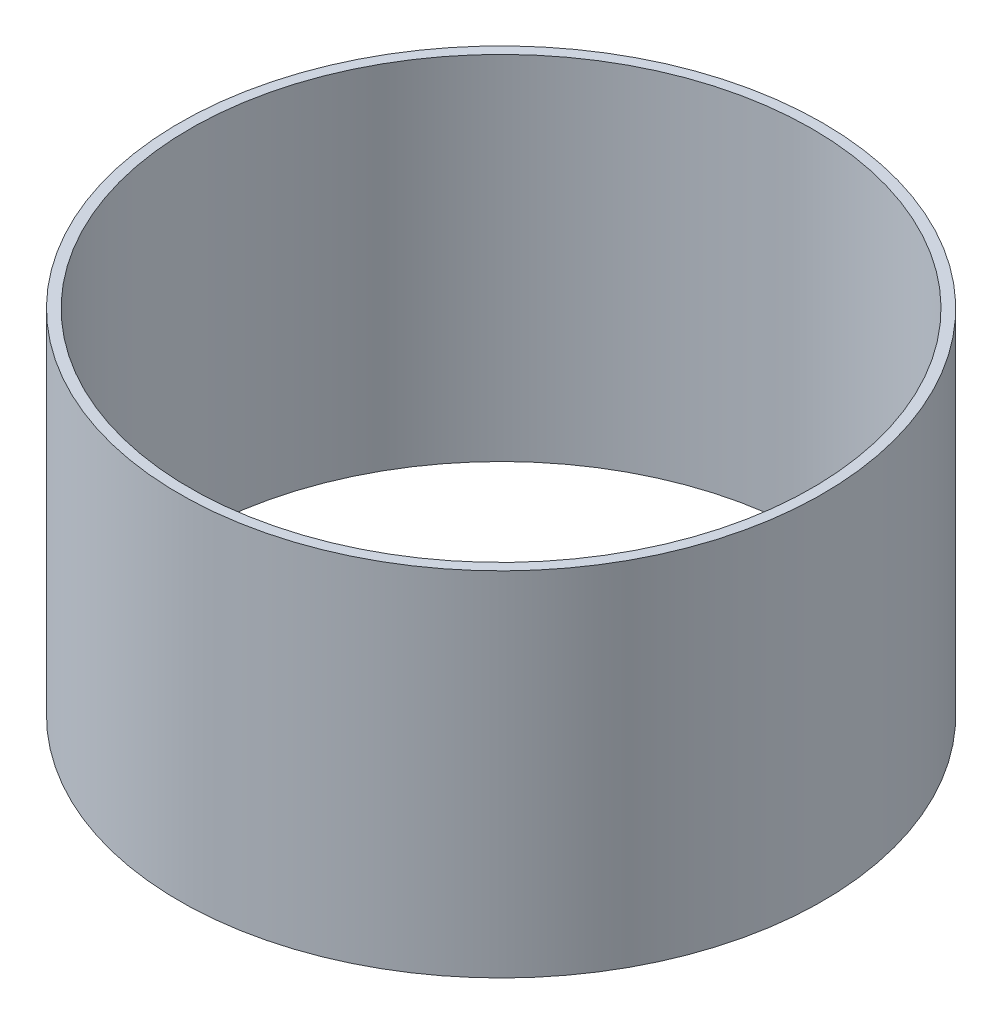
ISO-10303-21;
HEADER;
FILE_DESCRIPTION(('STEP AP214'),'2;1');
FILE_NAME('part.step','',(''),(''),'','','');
FILE_SCHEMA(('AUTOMOTIVE_DESIGN { 1 0 10303 214 1 1 1 1 }'));
ENDSEC;
DATA;
#1=APPLICATION_CONTEXT('core data for automotive mechanical design processes');
#2=APPLICATION_PROTOCOL_DEFINITION('international standard','automotive_design',2000,#1);
#3=PRODUCT_CONTEXT('',#1,'mechanical');
#4=PRODUCT('Part','Part','',(#3));
#5=PRODUCT_RELATED_PRODUCT_CATEGORY('part','',(#4));
#6=PRODUCT_DEFINITION_FORMATION('','',#4);
#7=PRODUCT_DEFINITION_CONTEXT('part definition',#1,'design');
#8=PRODUCT_DEFINITION('design','',#6,#7);
#9=PRODUCT_DEFINITION_SHAPE('','',#8);
#10=(LENGTH_UNIT() NAMED_UNIT(*) SI_UNIT(.MILLI.,.METRE.));
#11=(NAMED_UNIT(*) PLANE_ANGLE_UNIT() SI_UNIT($,.RADIAN.));
#12=(NAMED_UNIT(*) SI_UNIT($,.STERADIAN.) SOLID_ANGLE_UNIT());
#13=UNCERTAINTY_MEASURE_WITH_UNIT(LENGTH_MEASURE(1.E-05),#10,'distance_accuracy_value','');
#14=(GEOMETRIC_REPRESENTATION_CONTEXT(3) GLOBAL_UNCERTAINTY_ASSIGNED_CONTEXT((#13)) GLOBAL_UNIT_ASSIGNED_CONTEXT((#10,
#11,#12)) REPRESENTATION_CONTEXT('',''));
#15=CARTESIAN_POINT('',(0.,0.,0.));
#16=DIRECTION('',(0.,0.,1.));
#17=DIRECTION('',(1.,0.,0.));
#18=AXIS2_PLACEMENT_3D('',#15,#16,#17);
#19=CARTESIAN_POINT('',(0.,0.,0.));
#20=DIRECTION('',(0.,-1.,0.));
#21=DIRECTION('',(0.,0.,-1.));
#22=AXIS2_PLACEMENT_3D('',#19,#20,#21);
#23=CYLINDRICAL_SURFACE('',#22,155.);
#24=CARTESIAN_POINT('',(0.,170.,0.));
#25=DIRECTION('',(0.,-1.,0.));
#26=DIRECTION('',(0.,0.,-1.));
#27=AXIS2_PLACEMENT_3D('',#24,#25,#26);
#28=CIRCLE('',#27,155.);
#29=CARTESIAN_POINT('',(0.,170.,-155.));
#30=VERTEX_POINT('',#29);
#31=EDGE_CURVE('E10',#30,#30,#28,.T.);
#32=ORIENTED_EDGE('',*,*,#31,.T.);
#33=EDGE_LOOP('',(#32));
#34=FACE_BOUND('',#33,.T.);
#35=CARTESIAN_POINT('',(0.,0.,0.));
#36=DIRECTION('',(0.,-1.,0.));
#37=DIRECTION('',(0.,0.,-1.));
#38=AXIS2_PLACEMENT_3D('',#35,#36,#37);
#39=CIRCLE('',#38,155.);
#40=CARTESIAN_POINT('',(0.,0.,-155.));
#41=VERTEX_POINT('',#40);
#42=EDGE_CURVE('E53',#41,#41,#39,.T.);
#43=ORIENTED_EDGE('',*,*,#42,.F.);
#44=EDGE_LOOP('',(#43));
#45=FACE_BOUND('',#44,.T.);
#46=ADVANCED_FACE('F39',(#34,#45),#23,.T.);
#47=CARTESIAN_POINT('',(155.,170.,0.));
#48=DIRECTION('',(0.,1.,0.));
#49=DIRECTION('',(0.,0.,1.));
#50=AXIS2_PLACEMENT_3D('',#47,#48,#49);
#51=PLANE('',#50);
#52=CARTESIAN_POINT('',(0.,170.,0.));
#53=DIRECTION('',(0.,-1.,0.));
#54=DIRECTION('',(0.,0.,-1.));
#55=AXIS2_PLACEMENT_3D('',#52,#53,#54);
#56=CIRCLE('',#55,150.);
#57=CARTESIAN_POINT('',(0.,170.,-150.));
#58=VERTEX_POINT('',#57);
#59=EDGE_CURVE('E45',#58,#58,#56,.T.);
#60=ORIENTED_EDGE('',*,*,#59,.T.);
#61=EDGE_LOOP('',(#60));
#62=FACE_BOUND('',#61,.T.);
#63=ORIENTED_EDGE('',*,*,#31,.F.);
#64=EDGE_LOOP('',(#63));
#65=FACE_BOUND('',#64,.T.);
#66=ADVANCED_FACE('F63',(#62,#65),#51,.T.);
#67=CARTESIAN_POINT('',(0.,0.,0.));
#68=DIRECTION('',(0.,-1.,0.));
#69=DIRECTION('',(0.,0.,-1.));
#70=AXIS2_PLACEMENT_3D('',#67,#68,#69);
#71=CYLINDRICAL_SURFACE('',#70,150.);
#72=CARTESIAN_POINT('',(0.,0.,0.));
#73=DIRECTION('',(0.,-1.,0.));
#74=DIRECTION('',(0.,0.,-1.));
#75=AXIS2_PLACEMENT_3D('',#72,#73,#74);
#76=CIRCLE('',#75,150.);
#77=CARTESIAN_POINT('',(0.,0.,-150.));
#78=VERTEX_POINT('',#77);
#79=EDGE_CURVE('E49',#78,#78,#76,.T.);
#80=ORIENTED_EDGE('',*,*,#79,.T.);
#81=EDGE_LOOP('',(#80));
#82=FACE_BOUND('',#81,.T.);
#83=ORIENTED_EDGE('',*,*,#59,.F.);
#84=EDGE_LOOP('',(#83));
#85=FACE_BOUND('',#84,.T.);
#86=ADVANCED_FACE('F67',(#82,#85),#71,.F.);
#87=CARTESIAN_POINT('',(155.,0.,0.));
#88=DIRECTION('',(0.,-1.,0.));
#89=DIRECTION('',(0.,0.,-1.));
#90=AXIS2_PLACEMENT_3D('',#87,#88,#89);
#91=PLANE('',#90);
#92=ORIENTED_EDGE('',*,*,#42,.T.);
#93=EDGE_LOOP('',(#92));
#94=FACE_BOUND('',#93,.T.);
#95=ORIENTED_EDGE('',*,*,#79,.F.);
#96=EDGE_LOOP('',(#95));
#97=FACE_BOUND('',#96,.T.);
#98=ADVANCED_FACE('F59',(#94,#97),#91,.T.);
#99=CLOSED_SHELL('',(#46,#66,#86,#98));
#100=MANIFOLD_SOLID_BREP('B2',#99);
#101=ADVANCED_BREP_SHAPE_REPRESENTATION('',(#18,#100),#14);
#102=SHAPE_DEFINITION_REPRESENTATION(#9,#101);
ENDSEC;
END-ISO-10303-21;
